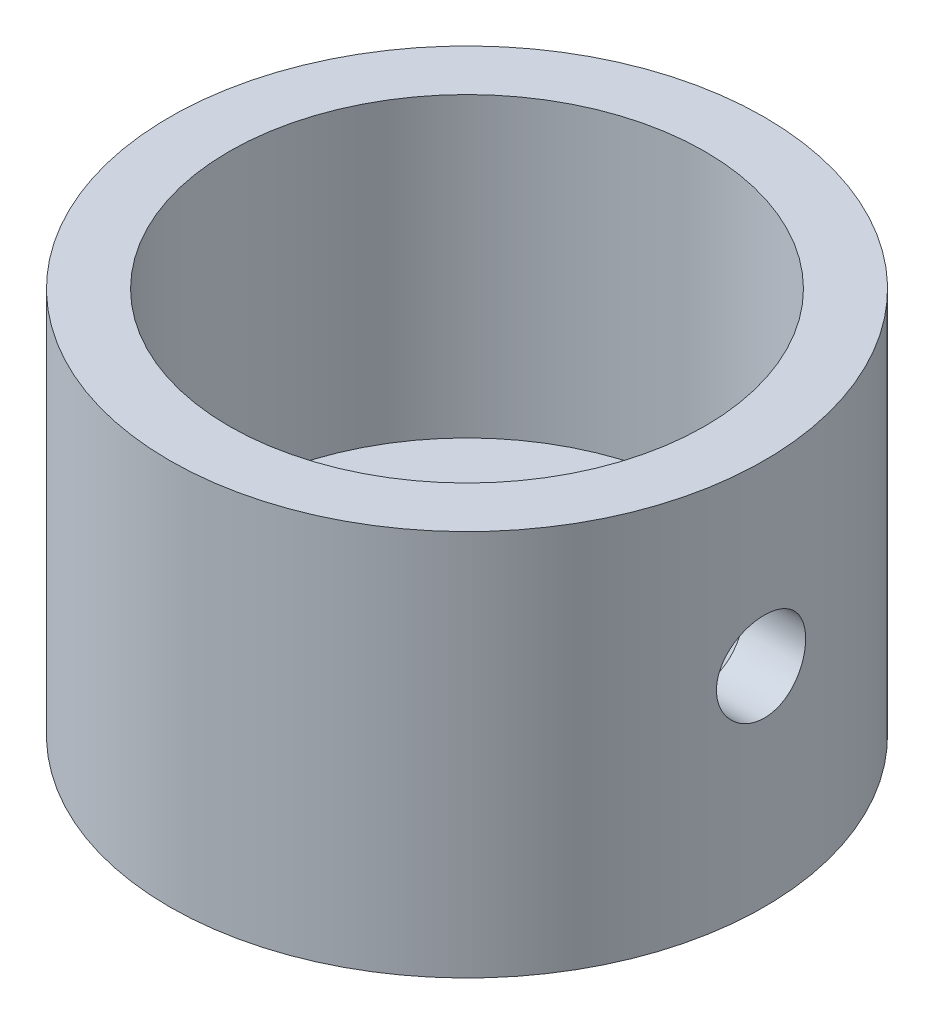
ISO-10303-21;
HEADER;
FILE_DESCRIPTION(('STEP AP214'),'2;1');
FILE_NAME('part.step','',(''),(''),'','','');
FILE_SCHEMA(('AUTOMOTIVE_DESIGN { 1 0 10303 214 1 1 1 1 }'));
ENDSEC;
DATA;
#1=APPLICATION_CONTEXT('core data for automotive mechanical design processes');
#2=APPLICATION_PROTOCOL_DEFINITION('international standard','automotive_design',2000,#1);
#3=PRODUCT_CONTEXT('',#1,'mechanical');
#4=PRODUCT('Part','Part','',(#3));
#5=PRODUCT_RELATED_PRODUCT_CATEGORY('part','',(#4));
#6=PRODUCT_DEFINITION_FORMATION('','',#4);
#7=PRODUCT_DEFINITION_CONTEXT('part definition',#1,'design');
#8=PRODUCT_DEFINITION('design','',#6,#7);
#9=PRODUCT_DEFINITION_SHAPE('','',#8);
#10=(LENGTH_UNIT() NAMED_UNIT(*) SI_UNIT(.MILLI.,.METRE.));
#11=(NAMED_UNIT(*) PLANE_ANGLE_UNIT() SI_UNIT($,.RADIAN.));
#12=(NAMED_UNIT(*) SI_UNIT($,.STERADIAN.) SOLID_ANGLE_UNIT());
#13=UNCERTAINTY_MEASURE_WITH_UNIT(LENGTH_MEASURE(1.E-05),#10,'distance_accuracy_value','');
#14=(GEOMETRIC_REPRESENTATION_CONTEXT(3) GLOBAL_UNCERTAINTY_ASSIGNED_CONTEXT((#13)) GLOBAL_UNIT_ASSIGNED_CONTEXT((#10,
#11,#12)) REPRESENTATION_CONTEXT('',''));
#15=CARTESIAN_POINT('',(0.,0.,0.));
#16=DIRECTION('',(0.,0.,1.));
#17=DIRECTION('',(1.,0.,0.));
#18=AXIS2_PLACEMENT_3D('',#15,#16,#17);
#19=CARTESIAN_POINT('',(0.,3.,0.));
#20=DIRECTION('',(0.,1.,0.));
#21=DIRECTION('',(0.,0.,1.));
#22=AXIS2_PLACEMENT_3D('',#19,#20,#21);
#23=PLANE('',#22);
#24=CARTESIAN_POINT('',(0.,3.,0.));
#25=DIRECTION('',(0.,1.,0.));
#26=DIRECTION('',(0.,0.,1.));
#27=AXIS2_PLACEMENT_3D('',#24,#25,#26);
#28=CIRCLE('',#27,1.75);
#29=CARTESIAN_POINT('',(0.,3.,1.75));
#30=VERTEX_POINT('',#29);
#31=EDGE_CURVE('E51',#30,#30,#28,.T.);
#32=ORIENTED_EDGE('',*,*,#31,.F.);
#33=EDGE_LOOP('',(#32));
#34=FACE_BOUND('',#33,.T.);
#35=CARTESIAN_POINT('',(0.,3.,0.));
#36=DIRECTION('',(0.,1.,0.));
#37=DIRECTION('',(0.,0.,1.));
#38=AXIS2_PLACEMENT_3D('',#35,#36,#37);
#39=CIRCLE('',#38,8.);
#40=CARTESIAN_POINT('',(0.,3.,8.));
#41=VERTEX_POINT('',#40);
#42=EDGE_CURVE('E10',#41,#41,#39,.F.);
#43=ORIENTED_EDGE('',*,*,#42,.F.);
#44=EDGE_LOOP('',(#43));
#45=FACE_BOUND('',#44,.T.);
#46=ADVANCED_FACE('F31',(#34,#45),#23,.T.);
#47=CARTESIAN_POINT('',(0.,3.,0.));
#48=DIRECTION('',(0.,-1.,0.));
#49=DIRECTION('',(0.,0.,-1.));
#50=AXIS2_PLACEMENT_3D('',#47,#48,#49);
#51=CYLINDRICAL_SURFACE('',#50,10.);
#52=CARTESIAN_POINT('',(9.88685996664259,7.,-1.5));
#53=CARTESIAN_POINT('',(9.88686136668592,6.91625443071005,-1.49999654107284));
#54=CARTESIAN_POINT('',(9.88793551739101,6.83246024924929,-1.49296296388491));
#55=CARTESIAN_POINT('',(9.8921131480324,6.66721468511687,-1.46502196657001));
#56=CARTESIAN_POINT('',(9.8952186073143,6.58576566851999,-1.44410101402628));
#57=CARTESIAN_POINT('',(9.90309938986228,6.4276262445531,-1.38902526098084));
#58=CARTESIAN_POINT('',(9.90787343131536,6.35093223745784,-1.35488061681397));
#59=CARTESIAN_POINT('',(9.91855194113145,6.20437296922792,-1.27435063087791));
#60=CARTESIAN_POINT('',(9.92445625383668,6.1345067697857,-1.22796697429872));
#61=CARTESIAN_POINT('',(9.93678289248039,6.00301618324567,-1.12387902418558));
#62=CARTESIAN_POINT('',(9.94320862458057,5.94145438659326,-1.0660960558482));
#63=CARTESIAN_POINT('',(9.95582368169047,5.8288625143445,-0.941019605444373));
#64=CARTESIAN_POINT('',(9.96201299368614,5.77783301783301,-0.873725600786529));
#65=CARTESIAN_POINT('',(9.97349347428185,5.68752336830864,-0.731136358052745));
#66=CARTESIAN_POINT('',(9.97878018435568,5.64830084967754,-0.655804227365766));
#67=CARTESIAN_POINT('',(9.98782206746404,5.58308840119182,-0.499528850106974));
#68=CARTESIAN_POINT('',(9.99157732141944,5.55709777215711,-0.418585900270677));
#69=CARTESIAN_POINT('',(9.99710914797782,5.51927661146916,-0.254031123090569));
#70=CARTESIAN_POINT('',(9.99890035887344,5.50734127361283,-0.170443884389866));
#71=CARTESIAN_POINT('',(10.0003524476958,5.4976440651751,-0.0024352040194786));
#72=CARTESIAN_POINT('',(10.0000134440494,5.49988140668031,0.0819861910157469));
#73=CARTESIAN_POINT('',(9.99725499660795,5.51838333776243,0.24855171820052));
#74=CARTESIAN_POINT('',(9.99485227652479,5.53453517179148,0.330708691400008));
#75=CARTESIAN_POINT('',(9.98825500227851,5.58023060632257,0.491132829143138));
#76=CARTESIAN_POINT('',(9.98406040199739,5.60977455150144,0.569399893513482));
#77=CARTESIAN_POINT('',(9.97432193873205,5.6815309969171,0.720163780770317));
#78=CARTESIAN_POINT('',(9.96877303515638,5.72379096510874,0.792637672323597));
#79=CARTESIAN_POINT('',(9.95694438245421,5.81974519366999,0.929507907150178));
#80=CARTESIAN_POINT('',(9.95066458523184,5.87344020670687,0.993903718271736));
#81=CARTESIAN_POINT('',(9.93800158192626,5.99136844882659,1.11345448272265));
#82=CARTESIAN_POINT('',(9.93161796623256,6.05570012197011,1.16851232950947));
#83=CARTESIAN_POINT('',(9.91952704453523,6.19274107712373,1.26706599338813));
#84=CARTESIAN_POINT('',(9.91381974269649,6.26545041071992,1.31056173927999));
#85=CARTESIAN_POINT('',(9.90372775286855,6.41728396294064,1.38476964534605));
#86=CARTESIAN_POINT('',(9.89934409845291,6.49641313366239,1.41547182270082));
#87=CARTESIAN_POINT('',(9.89241402899059,6.65878525514739,1.46312336208879));
#88=CARTESIAN_POINT('',(9.88986748446299,6.74202791554675,1.48007369337326));
#89=CARTESIAN_POINT('',(9.88692451395026,6.90940008957749,1.49960720086655));
#90=CARTESIAN_POINT('',(9.88650748802574,6.99351318820154,1.50232803265052));
#91=CARTESIAN_POINT('',(9.88781607937153,7.16099419481734,1.49369057019819));
#92=CARTESIAN_POINT('',(9.88954163015778,7.24436212585077,1.48233271282302));
#93=CARTESIAN_POINT('',(9.89492202461453,7.40755981796563,1.44597702952766));
#94=CARTESIAN_POINT('',(9.89856716482858,7.4874052049416,1.42104778527821));
#95=CARTESIAN_POINT('',(9.90736801825768,7.64178409204861,1.35832831947087));
#96=CARTESIAN_POINT('',(9.91252380607176,7.7163173296282,1.32053746276389));
#97=CARTESIAN_POINT('',(9.92381355687062,7.85857326033504,1.23283677995324));
#98=CARTESIAN_POINT('',(9.92995459279988,7.92624044727982,1.18283784561766));
#99=CARTESIAN_POINT('',(9.94250159433355,8.05227285987381,1.07226416837201));
#100=CARTESIAN_POINT('',(9.94890757490292,8.11063755918115,1.0116888274468));
#101=CARTESIAN_POINT('',(9.96132705217386,8.21690260663359,0.881075619628183));
#102=CARTESIAN_POINT('',(9.96733683460423,8.26471172824248,0.810963126771956));
#103=CARTESIAN_POINT('',(9.97822905032015,8.34787290526264,0.66362208026368));
#104=CARTESIAN_POINT('',(9.98311151444563,8.38322530146503,0.586393721360437));
#105=CARTESIAN_POINT('',(9.99118269660795,8.44032374248803,0.427297995861146));
#106=CARTESIAN_POINT('',(9.99437761717899,8.46211966707836,0.345448858754301));
#107=CARTESIAN_POINT('',(9.99873976656896,8.49164787953747,0.179200815501193));
#108=CARTESIAN_POINT('',(9.99990712930801,8.49938109624914,0.0948020781305807));
#109=CARTESIAN_POINT('',(10.0000812905914,8.5005417045494,-0.0732645908608188));
#110=CARTESIAN_POINT('',(9.99910917023796,8.49410868087698,-0.156931570212053));
#111=CARTESIAN_POINT('',(9.99515610519141,8.46741861157924,-0.321979795323107));
#112=CARTESIAN_POINT('',(9.99217516692666,8.44716161019144,-0.403361048396513));
#113=CARTESIAN_POINT('',(9.98453786742463,8.39344812442976,-0.561489374379661));
#114=CARTESIAN_POINT('',(9.97988273316947,8.36000130486107,-0.638239793148783));
#115=CARTESIAN_POINT('',(9.96940834495499,8.28087251201686,-0.785061117896603));
#116=CARTESIAN_POINT('',(9.96358905320338,8.23519014151966,-0.855131806920709));
#117=CARTESIAN_POINT('',(9.95136510636178,8.13238230117083,-0.987312585191959));
#118=CARTESIAN_POINT('',(9.94495548425941,8.07515377418366,-1.04934206644638));
#119=CARTESIAN_POINT('',(9.93231001689001,7.95109492691953,-1.16296808390268));
#120=CARTESIAN_POINT('',(9.92607421276291,7.88426235617565,-1.21456216798984));
#121=CARTESIAN_POINT('',(9.91444484029116,7.74245101676746,-1.30611310822974));
#122=CARTESIAN_POINT('',(9.90905620156985,7.66742858297817,-1.34600294291209));
#123=CARTESIAN_POINT('',(9.89978909110724,7.5117032232367,-1.41255613872045));
#124=CARTESIAN_POINT('',(9.89590905307931,7.43100629214218,-1.43923322574898));
#125=CARTESIAN_POINT('',(9.89099485524825,7.29162256374352,-1.47254951890026));
#126=CARTESIAN_POINT('',(9.88945249382379,7.23379660307573,-1.4828276978042));
#127=CARTESIAN_POINT('',(9.88738456567011,7.11732170826565,-1.49655410576574));
#128=CARTESIAN_POINT('',(9.88685898576155,7.05867278480039,-1.50000242335076));
#129=CARTESIAN_POINT('',(9.88685996664259,7.,-1.5));
#130=B_SPLINE_CURVE_WITH_KNOTS('',3,(#52,#53,#54,#55,#56,#57,#58,#59,#60,#61,#62,#63,#64,#65,
#66,#67,#68,#69,#70,#71,#72,#73,#74,#75,#76,#77,#78,#79,#80,#81,#82,#83,#84,#85,#86,#87,#88,#89,
#90,#91,#92,#93,#94,#95,#96,#97,#98,#99,#100,#101,#102,#103,#104,#105,#106,#107,#108,#109,#110,
#111,#112,#113,#114,#115,#116,#117,#118,#119,#120,#121,#122,#123,#124,#125,#126,#127,#128,#129),
.UNSPECIFIED.,.T.,.F.,(4,2,2,2,2,2,2,2,2,2,2,2,2,2,2,2,2,2,2,2,2,2,2,2,2,2,2,2,2,2,2,2,2,2,2,2,
2,2,4),(0.,0.251022251804869,0.502289469561802,0.753364085335675,1.00440414866133,
1.25724158649108,1.51009292207817,1.76415922105782,2.01821209364501,2.27035832534397,
2.52249053939374,2.77259862515728,3.02271314839401,3.27377316386454,3.52484970949272,
3.77839544666269,4.0319427451435,4.28568751773139,4.53941440444341,4.79068214603744,
5.04194209099918,5.29194394807374,5.54195815286117,5.79385486001302,6.04576581461802,
6.29977537753516,6.55377799071854,6.8068404089109,7.05988611170473,7.31044963622327,
7.56101235892823,7.81139182257833,8.06177941567107,8.31450950010969,8.56729890236862,
8.82150878824931,9.07545403445564,9.25132441891613,9.42719252376192),.UNSPECIFIED.);
#131=CARTESIAN_POINT('',(9.88685996664259,7.,-1.5));
#132=VERTEX_POINT('',#131);
#133=EDGE_CURVE('E62',#132,#132,#130,.T.);
#134=ORIENTED_EDGE('',*,*,#133,.T.);
#135=EDGE_LOOP('',(#134));
#136=FACE_BOUND('',#135,.T.);
#137=CARTESIAN_POINT('',(0.,0.,0.));
#138=DIRECTION('',(0.,1.,0.));
#139=DIRECTION('',(0.,0.,1.));
#140=AXIS2_PLACEMENT_3D('',#137,#138,#139);
#141=CIRCLE('',#140,10.);
#142=CARTESIAN_POINT('',(0.,0.,10.));
#143=VERTEX_POINT('',#142);
#144=EDGE_CURVE('E44',#143,#143,#141,.T.);
#145=ORIENTED_EDGE('',*,*,#144,.T.);
#146=EDGE_LOOP('',(#145));
#147=FACE_BOUND('',#146,.T.);
#148=CARTESIAN_POINT('',(0.,13.,0.));
#149=DIRECTION('',(0.,1.,0.));
#150=DIRECTION('',(0.,0.,1.));
#151=AXIS2_PLACEMENT_3D('',#148,#149,#150);
#152=CIRCLE('',#151,10.);
#153=CARTESIAN_POINT('',(0.,13.,10.));
#154=VERTEX_POINT('',#153);
#155=EDGE_CURVE('E54',#154,#154,#152,.T.);
#156=ORIENTED_EDGE('',*,*,#155,.F.);
#157=EDGE_LOOP('',(#156));
#158=FACE_BOUND('',#157,.T.);
#159=ADVANCED_FACE('F33',(#136,#147,#158),#51,.T.);
#160=CARTESIAN_POINT('',(0.,0.,0.));
#161=DIRECTION('',(0.,1.,0.));
#162=DIRECTION('',(0.,0.,1.));
#163=AXIS2_PLACEMENT_3D('',#160,#161,#162);
#164=PLANE('',#163);
#165=CARTESIAN_POINT('',(0.,0.,0.));
#166=DIRECTION('',(0.,1.,0.));
#167=DIRECTION('',(0.,0.,1.));
#168=AXIS2_PLACEMENT_3D('',#165,#166,#167);
#169=CIRCLE('',#168,1.75);
#170=CARTESIAN_POINT('',(0.,0.,1.75));
#171=VERTEX_POINT('',#170);
#172=EDGE_CURVE('E48',#171,#171,#169,.T.);
#173=ORIENTED_EDGE('',*,*,#172,.T.);
#174=EDGE_LOOP('',(#173));
#175=FACE_BOUND('',#174,.T.);
#176=ORIENTED_EDGE('',*,*,#144,.F.);
#177=EDGE_LOOP('',(#176));
#178=FACE_BOUND('',#177,.T.);
#179=ADVANCED_FACE('F83',(#175,#178),#164,.F.);
#180=CARTESIAN_POINT('',(0.,0.,0.));
#181=DIRECTION('',(0.,1.,0.));
#182=DIRECTION('',(0.,0.,1.));
#183=AXIS2_PLACEMENT_3D('',#180,#181,#182);
#184=CYLINDRICAL_SURFACE('',#183,1.75);
#185=ORIENTED_EDGE('',*,*,#172,.F.);
#186=EDGE_LOOP('',(#185));
#187=FACE_BOUND('',#186,.T.);
#188=ORIENTED_EDGE('',*,*,#31,.T.);
#189=EDGE_LOOP('',(#188));
#190=FACE_BOUND('',#189,.T.);
#191=ADVANCED_FACE('F79',(#187,#190),#184,.F.);
#192=CARTESIAN_POINT('',(0.,13.,0.));
#193=DIRECTION('',(0.,1.,0.));
#194=DIRECTION('',(0.,0.,1.));
#195=AXIS2_PLACEMENT_3D('',#192,#193,#194);
#196=PLANE('',#195);
#197=ORIENTED_EDGE('',*,*,#155,.T.);
#198=EDGE_LOOP('',(#197));
#199=FACE_BOUND('',#198,.T.);
#200=CARTESIAN_POINT('',(0.,13.,0.));
#201=DIRECTION('',(0.,1.,0.));
#202=DIRECTION('',(0.,0.,1.));
#203=AXIS2_PLACEMENT_3D('',#200,#201,#202);
#204=CIRCLE('',#203,8.);
#205=CARTESIAN_POINT('',(0.,13.,8.));
#206=VERTEX_POINT('',#205);
#207=EDGE_CURVE('E59',#206,#206,#204,.T.);
#208=ORIENTED_EDGE('',*,*,#207,.F.);
#209=EDGE_LOOP('',(#208));
#210=FACE_BOUND('',#209,.T.);
#211=ADVANCED_FACE('F75',(#199,#210),#196,.T.);
#212=CARTESIAN_POINT('',(0.,13.,0.));
#213=DIRECTION('',(0.,-1.,0.));
#214=DIRECTION('',(0.,0.,-1.));
#215=AXIS2_PLACEMENT_3D('',#212,#213,#214);
#216=CYLINDRICAL_SURFACE('',#215,8.);
#217=CARTESIAN_POINT('',(7.85811682275085,7.,-1.5));
#218=CARTESIAN_POINT('',(7.85811843793493,6.91654279198826,-1.49999679883246));
#219=CARTESIAN_POINT('',(7.85946079760266,6.83304405178161,-1.49301126348936));
#220=CARTESIAN_POINT('',(7.86467851014364,6.66840103841809,-1.46527253251805));
#221=CARTESIAN_POINT('',(7.86855601173205,6.58725882357252,-1.44450765768477));
#222=CARTESIAN_POINT('',(7.87838976464884,6.42973492862912,-1.38987035617788));
#223=CARTESIAN_POINT('',(7.88434407905997,6.35334889069271,-1.35601013954374));
#224=CARTESIAN_POINT('',(7.89765826320959,6.20734644071319,-1.27617565760366));
#225=CARTESIAN_POINT('',(7.90501802325621,6.1377295009967,-1.23020233759193));
#226=CARTESIAN_POINT('',(7.92041614838944,6.00636980080087,-1.12683678942622));
#227=CARTESIAN_POINT('',(7.92846116625679,5.94472351652827,-1.06932292933092));
#228=CARTESIAN_POINT('',(7.94426457664034,5.83189561040044,-0.944771778803551));
#229=CARTESIAN_POINT('',(7.95202295031152,5.78071467557521,-0.877733863624944));
#230=CARTESIAN_POINT('',(7.96645017828405,5.68990062339948,-0.735403894570161));
#231=CARTESIAN_POINT('',(7.97311028052363,5.65035846648058,-0.660052840033864));
#232=CARTESIAN_POINT('',(7.9845160863293,5.58453045772647,-0.503631283250761));
#233=CARTESIAN_POINT('',(7.98926194728334,5.55824351600978,-0.422561251859504));
#234=CARTESIAN_POINT('',(7.99625755123778,5.51997045138887,-0.258002746187415));
#235=CARTESIAN_POINT('',(7.99853565976327,5.50782169407731,-0.174553323244856));
#236=CARTESIAN_POINT('',(8.00043684615594,5.4976631122996,-0.00677167603538201));
#237=CARTESIAN_POINT('',(8.00006015010697,5.49965208386094,0.0775604724476713));
#238=CARTESIAN_POINT('',(7.99671633763241,5.51758777114715,0.243598357899398));
#239=CARTESIAN_POINT('',(7.99378172247214,5.53335936943001,0.32532376045147));
#240=CARTESIAN_POINT('',(7.98568826333561,5.57813564939524,0.484947165715476));
#241=CARTESIAN_POINT('',(7.98052933829966,5.60714081334581,0.562845028826541));
#242=CARTESIAN_POINT('',(7.96851260297339,5.6777277310583,0.713110065751522));
#243=CARTESIAN_POINT('',(7.96164537590825,5.7193794879125,0.785443571838534));
#244=CARTESIAN_POINT('',(7.9469714754285,5.81402566907715,0.922159977214639));
#245=CARTESIAN_POINT('',(7.93916470651164,5.86702124688758,0.986542066910785));
#246=CARTESIAN_POINT('',(7.92333513680567,5.98381570298353,1.10656561896904));
#247=CARTESIAN_POINT('',(7.91531085901621,6.04776778390208,1.16205790757041));
#248=CARTESIAN_POINT('',(7.9000650892462,6.18414953127863,1.26155171851261));
#249=CARTESIAN_POINT('',(7.8928436090135,6.25657932176464,1.30555307271182));
#250=CARTESIAN_POINT('',(7.88001893307121,6.40805827070266,1.38085852224478));
#251=CARTESIAN_POINT('',(7.87441850530261,6.48711845719065,1.41214093645421));
#252=CARTESIAN_POINT('',(7.86551242396689,6.6495011841232,1.46093656975056));
#253=CARTESIAN_POINT('',(7.86220651038619,6.73282324046478,1.47845134901108));
#254=CARTESIAN_POINT('',(7.85831520301005,6.90001932885588,1.49899672649739));
#255=CARTESIAN_POINT('',(7.85768955816136,6.98386611556552,1.50224164285859));
#256=CARTESIAN_POINT('',(7.8591219142084,7.15090345508715,1.49472968881724));
#257=CARTESIAN_POINT('',(7.86117978238611,7.23409404014808,1.48397351086433));
#258=CARTESIAN_POINT('',(7.86770980063205,7.39675290305439,1.44894868195883));
#259=CARTESIAN_POINT('',(7.87216186690878,7.4762462526249,1.4247923858399));
#260=CARTESIAN_POINT('',(7.88296134156618,7.63005718973016,1.3637722437906));
#261=CARTESIAN_POINT('',(7.88930888963281,7.70437439531533,1.32690746128795));
#262=CARTESIAN_POINT('',(7.90327577863685,7.84666761904317,1.2410235311966));
#263=CARTESIAN_POINT('',(7.91090895425315,7.91456053786607,1.19186899639621));
#264=CARTESIAN_POINT('',(7.926548113681,8.04121204021433,1.08298344344247));
#265=CARTESIAN_POINT('',(7.93455413096493,8.09996980155577,1.02325147433084));
#266=CARTESIAN_POINT('',(7.95016624005945,8.20748376353413,0.893949417870385));
#267=CARTESIAN_POINT('',(7.95776555833305,8.25609582660597,0.82425853409589));
#268=CARTESIAN_POINT('',(7.9715940481035,8.34092120617766,0.677574523040139));
#269=CARTESIAN_POINT('',(7.97782327234725,8.37713500002501,0.600581677038528));
#270=CARTESIAN_POINT('',(7.98818057995847,8.43592009786408,0.441877541578683));
#271=CARTESIAN_POINT('',(7.99231954730142,8.45856218756141,0.360193213078987));
#272=CARTESIAN_POINT('',(7.99807642083745,8.48978704828989,0.194096227381569));
#273=CARTESIAN_POINT('',(7.99969459229933,8.49837129866271,0.10968385821585));
#274=CARTESIAN_POINT('',(8.00022227515441,8.50118530151844,-0.0580907602505104));
#275=CARTESIAN_POINT('',(7.99917286625032,8.49563275312953,-0.141449307066269));
#276=CARTESIAN_POINT('',(7.99456866611702,8.47080757223156,-0.306023369279201));
#277=CARTESIAN_POINT('',(7.99101389890671,8.45153507125579,-0.387238905213691));
#278=CARTESIAN_POINT('',(7.98179837978045,8.39990879261628,-0.545106475595486));
#279=CARTESIAN_POINT('',(7.97614135981575,8.36757818711899,-0.621766319318225));
#280=CARTESIAN_POINT('',(7.96333372068771,8.29077954634482,-0.768605631316696));
#281=CARTESIAN_POINT('',(7.95618300146483,8.24631069789335,-0.838784665003272));
#282=CARTESIAN_POINT('',(7.94104779859941,8.14574854555768,-0.971755027780008));
#283=CARTESIAN_POINT('',(7.93305284591272,8.08949796613829,-1.03442623539053));
#284=CARTESIAN_POINT('',(7.91719633538833,7.96729543750729,-1.14951536065485));
#285=CARTESIAN_POINT('',(7.90933480936764,7.90134120962628,-1.2019308632478));
#286=CARTESIAN_POINT('',(7.89455577425926,7.76087354529665,-1.29547633945385));
#287=CARTESIAN_POINT('',(7.88764767280728,7.68628656033236,-1.33649740531872));
#288=CARTESIAN_POINT('',(7.87567084650033,7.53117421002026,-1.40536132423417));
#289=CARTESIAN_POINT('',(7.87060038649116,7.45065453341062,-1.43321661638912));
#290=CARTESIAN_POINT('',(7.86393016292125,7.30824771193408,-1.46929726596175));
#291=CARTESIAN_POINT('',(7.86176310717932,7.24719427623805,-1.4807910573985));
#292=CARTESIAN_POINT('',(7.85885585595504,7.12410153157968,-1.49614351076215));
#293=CARTESIAN_POINT('',(7.85811562163282,7.06206224949967,-1.50000238052127));
#294=CARTESIAN_POINT('',(7.85811682275085,7.,-1.5));
#295=B_SPLINE_CURVE_WITH_KNOTS('',3,(#217,#218,#219,#220,#221,#222,#223,#224,#225,#226,#227,
#228,#229,#230,#231,#232,#233,#234,#235,#236,#237,#238,#239,#240,#241,#242,#243,#244,#245,#246,
#247,#248,#249,#250,#251,#252,#253,#254,#255,#256,#257,#258,#259,#260,#261,#262,#263,#264,#265,
#266,#267,#268,#269,#270,#271,#272,#273,#274,#275,#276,#277,#278,#279,#280,#281,#282,#283,#284,
#285,#286,#287,#288,#289,#290,#291,#292,#293,#294),.UNSPECIFIED.,.T.,.F.,(4,2,2,2,2,2,2,2,2,2,2,
2,2,2,2,2,2,2,2,2,2,2,2,2,2,2,2,2,2,2,2,2,2,2,2,2,2,2,4),(0.,0.250144505793186,
0.500501302380393,0.750625227978433,1.00072963993908,1.25362335698691,1.50653367069315,
1.76137104348047,2.0161874593964,2.26804275460261,2.51987660200648,2.76855650598725,
3.01724547328425,3.26733691984219,3.51745380911785,3.77140614764064,4.025362201924,
4.27974936118267,4.53410768866488,4.78463248587075,5.03514489338718,5.28358792315369,
5.53204926624317,5.78337862654144,6.03473059394677,6.28944125495871,6.54414210821705,
6.79750269418683,7.0508366166733,7.30029300570138,7.54974700322167,7.79876026530358,
8.0477902135711,8.30038464008745,8.55303847730765,8.80803001818118,9.06278015749119,
9.24880307527214,9.43482092920425),.UNSPECIFIED.);
#296=CARTESIAN_POINT('',(7.85811682275085,7.,-1.5));
#297=VERTEX_POINT('',#296);
#298=EDGE_CURVE('E36',#297,#297,#295,.T.);
#299=ORIENTED_EDGE('',*,*,#298,.F.);
#300=EDGE_LOOP('',(#299));
#301=FACE_BOUND('',#300,.T.);
#302=ORIENTED_EDGE('',*,*,#207,.T.);
#303=EDGE_LOOP('',(#302));
#304=FACE_BOUND('',#303,.T.);
#305=ORIENTED_EDGE('',*,*,#42,.T.);
#306=EDGE_LOOP('',(#305));
#307=FACE_BOUND('',#306,.T.);
#308=ADVANCED_FACE('F69',(#301,#304,#307),#216,.F.);
#309=CARTESIAN_POINT('',(5.,7.,0.));
#310=DIRECTION('',(1.,0.,0.));
#311=DIRECTION('',(0.,0.,-1.));
#312=AXIS2_PLACEMENT_3D('',#309,#310,#311);
#313=CYLINDRICAL_SURFACE('',#312,1.5);
#314=ORIENTED_EDGE('',*,*,#298,.T.);
#315=EDGE_LOOP('',(#314));
#316=FACE_BOUND('',#315,.T.);
#317=ORIENTED_EDGE('',*,*,#133,.F.);
#318=EDGE_LOOP('',(#317));
#319=FACE_BOUND('',#318,.T.);
#320=ADVANCED_FACE('F66',(#316,#319),#313,.F.);
#321=CLOSED_SHELL('',(#46,#159,#179,#191,#211,#308,#320));
#322=MANIFOLD_SOLID_BREP('B2',#321);
#323=ADVANCED_BREP_SHAPE_REPRESENTATION('',(#18,#322),#14);
#324=SHAPE_DEFINITION_REPRESENTATION(#9,#323);
ENDSEC;
END-ISO-10303-21;
